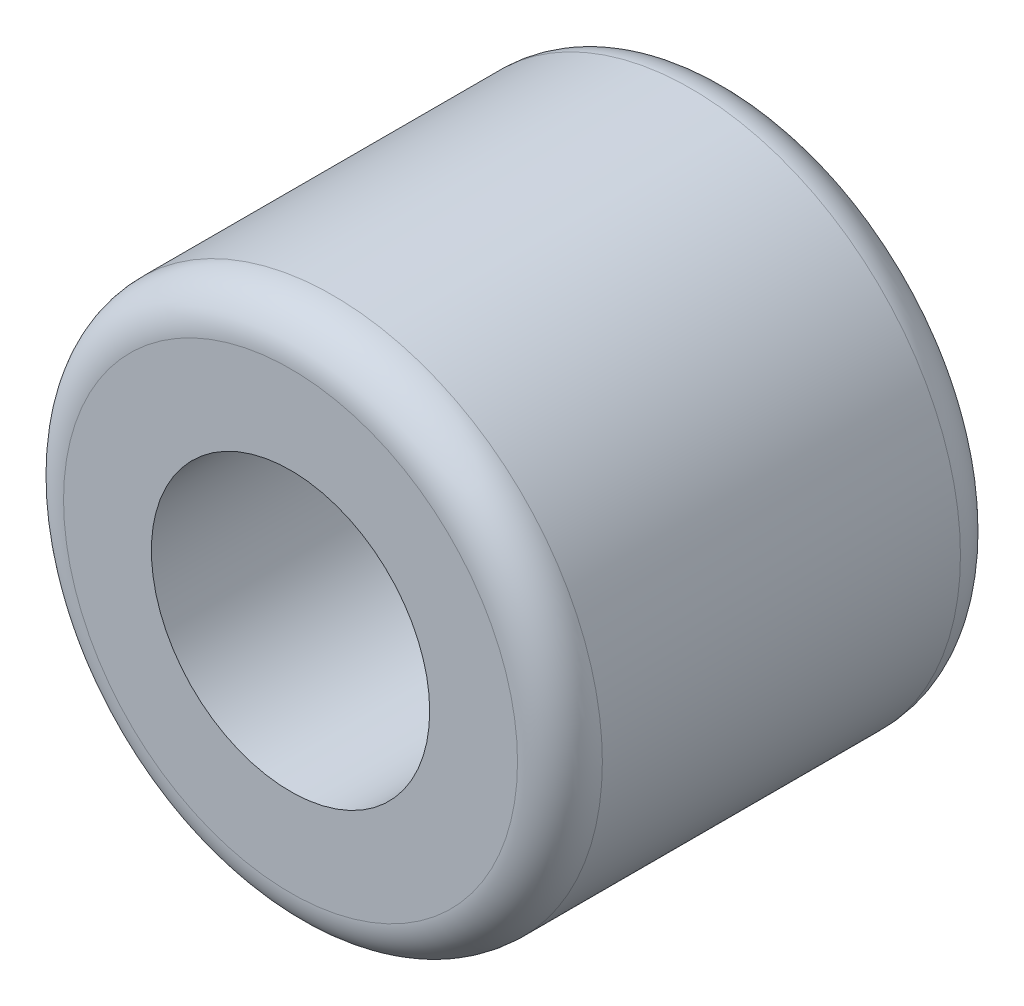
ISO-10303-21;
HEADER;
FILE_DESCRIPTION(('STEP AP214'),'2;1');
FILE_NAME('part.step','',(''),(''),'','','');
FILE_SCHEMA(('AUTOMOTIVE_DESIGN { 1 0 10303 214 1 1 1 1 }'));
ENDSEC;
DATA;
#1=APPLICATION_CONTEXT('core data for automotive mechanical design processes');
#2=APPLICATION_PROTOCOL_DEFINITION('international standard','automotive_design',2000,#1);
#3=PRODUCT_CONTEXT('',#1,'mechanical');
#4=PRODUCT('Part','Part','',(#3));
#5=PRODUCT_RELATED_PRODUCT_CATEGORY('part','',(#4));
#6=PRODUCT_DEFINITION_FORMATION('','',#4);
#7=PRODUCT_DEFINITION_CONTEXT('part definition',#1,'design');
#8=PRODUCT_DEFINITION('design','',#6,#7);
#9=PRODUCT_DEFINITION_SHAPE('','',#8);
#10=(LENGTH_UNIT() NAMED_UNIT(*) SI_UNIT(.MILLI.,.METRE.));
#11=(NAMED_UNIT(*) PLANE_ANGLE_UNIT() SI_UNIT($,.RADIAN.));
#12=(NAMED_UNIT(*) SI_UNIT($,.STERADIAN.) SOLID_ANGLE_UNIT());
#13=UNCERTAINTY_MEASURE_WITH_UNIT(LENGTH_MEASURE(1.E-05),#10,'distance_accuracy_value','');
#14=(GEOMETRIC_REPRESENTATION_CONTEXT(3) GLOBAL_UNCERTAINTY_ASSIGNED_CONTEXT((#13)) GLOBAL_UNIT_ASSIGNED_CONTEXT((#10,
#11,#12)) REPRESENTATION_CONTEXT('',''));
#15=CARTESIAN_POINT('',(0.,0.,0.));
#16=DIRECTION('',(0.,0.,1.));
#17=DIRECTION('',(1.,0.,0.));
#18=AXIS2_PLACEMENT_3D('',#15,#16,#17);
#19=CARTESIAN_POINT('',(12.7,0.,-16.6666666666667));
#20=DIRECTION('',(0.,0.,1.));
#21=DIRECTION('',(1.,0.,0.));
#22=AXIS2_PLACEMENT_3D('',#19,#20,#21);
#23=CYLINDRICAL_SURFACE('',#22,4.37333333333333);
#24=CARTESIAN_POINT('',(12.7,0.,-6.96));
#25=DIRECTION('',(0.,0.,1.));
#26=DIRECTION('',(1.,0.,0.));
#27=AXIS2_PLACEMENT_3D('',#24,#25,#26);
#28=CIRCLE('',#27,4.37333333333333);
#29=CARTESIAN_POINT('',(17.0733333333333,0.,-6.96));
#30=VERTEX_POINT('',#29);
#31=EDGE_CURVE('E38',#30,#30,#28,.F.);
#32=ORIENTED_EDGE('',*,*,#31,.T.);
#33=EDGE_LOOP('',(#32));
#34=FACE_BOUND('',#33,.T.);
#35=CARTESIAN_POINT('',(12.7,0.,6.96));
#36=DIRECTION('',(0.,0.,1.));
#37=DIRECTION('',(1.,0.,0.));
#38=AXIS2_PLACEMENT_3D('',#35,#36,#37);
#39=CIRCLE('',#38,4.37333333333333);
#40=CARTESIAN_POINT('',(17.0733333333333,0.,6.96));
#41=VERTEX_POINT('',#40);
#42=EDGE_CURVE('E109',#41,#41,#39,.F.);
#43=ORIENTED_EDGE('',*,*,#42,.F.);
#44=EDGE_LOOP('',(#43));
#45=FACE_BOUND('',#44,.T.);
#46=ADVANCED_FACE('F35',(#34,#45),#23,.F.);
#47=CARTESIAN_POINT('',(12.7,0.,-6.96));
#48=DIRECTION('',(0.,0.,1.));
#49=DIRECTION('',(1.,0.,0.));
#50=AXIS2_PLACEMENT_3D('',#47,#48,#49);
#51=PLANE('',#50);
#52=ORIENTED_EDGE('',*,*,#31,.F.);
#53=EDGE_LOOP('',(#52));
#54=FACE_BOUND('',#53,.T.);
#55=CARTESIAN_POINT('',(12.7,0.,-6.96));
#56=DIRECTION('',(0.,0.,1.));
#57=DIRECTION('',(-1.,0.,0.));
#58=AXIS2_PLACEMENT_3D('',#55,#56,#57);
#59=CIRCLE('',#58,7.13333333333333);
#60=CARTESIAN_POINT('',(5.56666666666667,0.,-6.96));
#61=VERTEX_POINT('',#60);
#62=EDGE_CURVE('E81',#61,#61,#59,.T.);
#63=ORIENTED_EDGE('',*,*,#62,.F.);
#64=EDGE_LOOP('',(#63));
#65=FACE_BOUND('',#64,.T.);
#66=ADVANCED_FACE('F86',(#54,#65),#51,.F.);
#67=CARTESIAN_POINT('',(12.7,0.,6.96));
#68=DIRECTION('',(0.,0.,1.));
#69=DIRECTION('',(1.,0.,0.));
#70=AXIS2_PLACEMENT_3D('',#67,#68,#69);
#71=PLANE('',#70);
#72=ORIENTED_EDGE('',*,*,#42,.T.);
#73=EDGE_LOOP('',(#72));
#74=FACE_BOUND('',#73,.T.);
#75=CARTESIAN_POINT('',(12.7,0.,6.96));
#76=DIRECTION('',(0.,0.,-1.));
#77=DIRECTION('',(-1.,0.,0.));
#78=AXIS2_PLACEMENT_3D('',#75,#76,#77);
#79=CIRCLE('',#78,7.13333333333333);
#80=CARTESIAN_POINT('',(5.56666666666667,0.,6.96));
#81=VERTEX_POINT('',#80);
#82=EDGE_CURVE('E47',#81,#81,#79,.T.);
#83=ORIENTED_EDGE('',*,*,#82,.F.);
#84=EDGE_LOOP('',(#83));
#85=FACE_BOUND('',#84,.T.);
#86=ADVANCED_FACE('F94',(#74,#85),#71,.T.);
#87=CARTESIAN_POINT('',(12.7,0.,-5.62666666666667));
#88=DIRECTION('',(0.,0.,-1.));
#89=DIRECTION('',(-1.,0.,0.));
#90=AXIS2_PLACEMENT_3D('',#87,#88,#89);
#91=TOROIDAL_SURFACE('',#90,7.13333333333333,1.33333333333333);
#92=CARTESIAN_POINT('',(12.7,0.,-5.62666666666667));
#93=DIRECTION('',(0.,0.,1.));
#94=DIRECTION('',(1.,0.,0.));
#95=AXIS2_PLACEMENT_3D('',#92,#93,#94);
#96=CIRCLE('',#95,8.46666666666667);
#97=CARTESIAN_POINT('',(21.1666666666667,0.,-5.62666666666667));
#98=VERTEX_POINT('',#97);
#99=EDGE_CURVE('E42',#98,#98,#96,.T.);
#100=ORIENTED_EDGE('',*,*,#99,.F.);
#101=EDGE_LOOP('',(#100));
#102=FACE_BOUND('',#101,.T.);
#103=ORIENTED_EDGE('',*,*,#62,.T.);
#104=EDGE_LOOP('',(#103));
#105=FACE_BOUND('',#104,.T.);
#106=ADVANCED_FACE('F61',(#102,#105),#91,.T.);
#107=CARTESIAN_POINT('',(12.7,0.,5.62666666666667));
#108=DIRECTION('',(0.,0.,1.));
#109=DIRECTION('',(-1.,0.,0.));
#110=AXIS2_PLACEMENT_3D('',#107,#108,#109);
#111=TOROIDAL_SURFACE('',#110,7.13333333333333,1.33333333333333);
#112=CARTESIAN_POINT('',(12.7,0.,5.62666666666667));
#113=DIRECTION('',(0.,0.,1.));
#114=DIRECTION('',(1.,0.,0.));
#115=AXIS2_PLACEMENT_3D('',#112,#113,#114);
#116=CIRCLE('',#115,8.46666666666667);
#117=CARTESIAN_POINT('',(21.1666666666667,0.,5.62666666666667));
#118=VERTEX_POINT('',#117);
#119=EDGE_CURVE('E10',#118,#118,#116,.F.);
#120=ORIENTED_EDGE('',*,*,#119,.F.);
#121=EDGE_LOOP('',(#120));
#122=FACE_BOUND('',#121,.T.);
#123=ORIENTED_EDGE('',*,*,#82,.T.);
#124=EDGE_LOOP('',(#123));
#125=FACE_BOUND('',#124,.T.);
#126=ADVANCED_FACE('F55',(#122,#125),#111,.T.);
#127=CARTESIAN_POINT('',(12.7,0.,-6.96));
#128=DIRECTION('',(0.,0.,1.));
#129=DIRECTION('',(1.,0.,0.));
#130=AXIS2_PLACEMENT_3D('',#127,#128,#129);
#131=CYLINDRICAL_SURFACE('',#130,8.46666666666667);
#132=ORIENTED_EDGE('',*,*,#119,.T.);
#133=EDGE_LOOP('',(#132));
#134=FACE_BOUND('',#133,.T.);
#135=ORIENTED_EDGE('',*,*,#99,.T.);
#136=EDGE_LOOP('',(#135));
#137=FACE_BOUND('',#136,.T.);
#138=ADVANCED_FACE('F60',(#134,#137),#131,.T.);
#139=CLOSED_SHELL('',(#46,#66,#86,#106,#126,#138));
#140=MANIFOLD_SOLID_BREP('B2',#139);
#141=ADVANCED_BREP_SHAPE_REPRESENTATION('',(#18,#140),#14);
#142=SHAPE_DEFINITION_REPRESENTATION(#9,#141);
ENDSEC;
END-ISO-10303-21;
